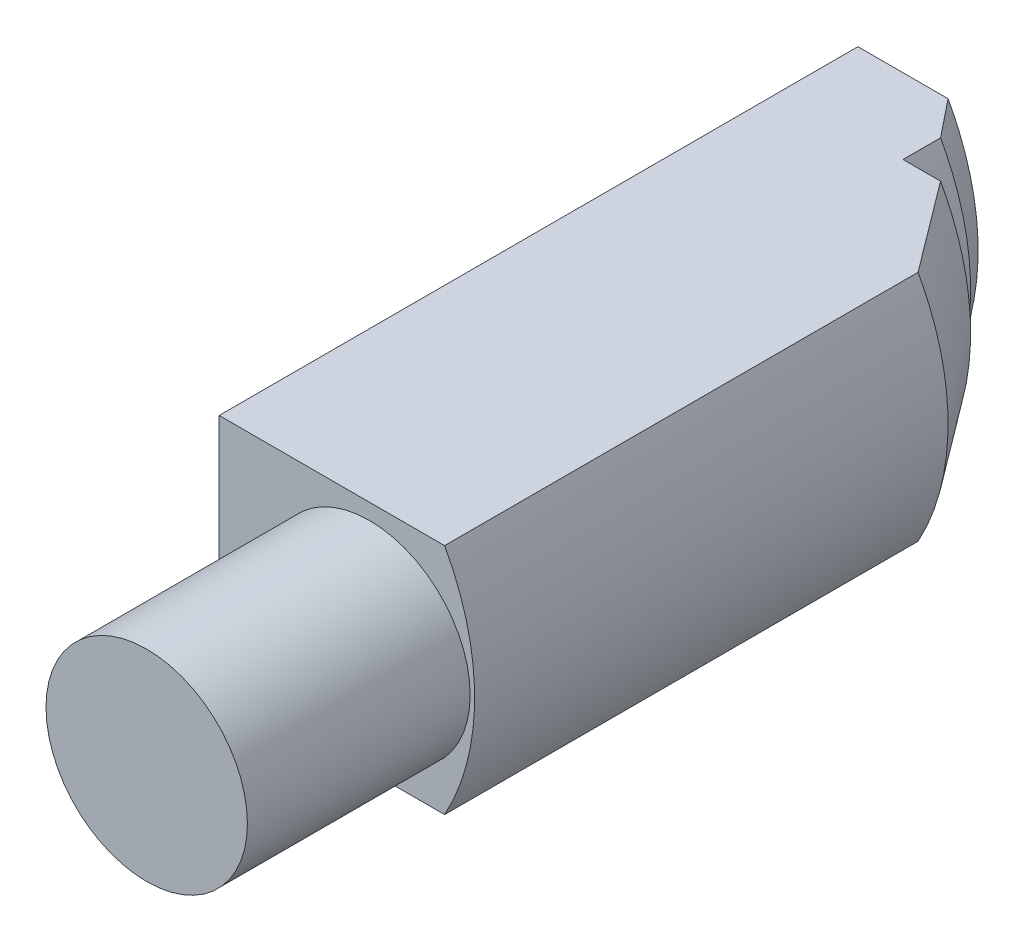
ISO-10303-21;
HEADER;
FILE_DESCRIPTION(('STEP AP214'),'2;1');
FILE_NAME('part.step','',(''),(''),'','','');
FILE_SCHEMA(('AUTOMOTIVE_DESIGN { 1 0 10303 214 1 1 1 1 }'));
ENDSEC;
DATA;
#1=APPLICATION_CONTEXT('core data for automotive mechanical design processes');
#2=APPLICATION_PROTOCOL_DEFINITION('international standard','automotive_design',2000,#1);
#3=PRODUCT_CONTEXT('',#1,'mechanical');
#4=PRODUCT('Part','Part','',(#3));
#5=PRODUCT_RELATED_PRODUCT_CATEGORY('part','',(#4));
#6=PRODUCT_DEFINITION_FORMATION('','',#4);
#7=PRODUCT_DEFINITION_CONTEXT('part definition',#1,'design');
#8=PRODUCT_DEFINITION('design','',#6,#7);
#9=PRODUCT_DEFINITION_SHAPE('','',#8);
#10=(LENGTH_UNIT() NAMED_UNIT(*) SI_UNIT(.MILLI.,.METRE.));
#11=(NAMED_UNIT(*) PLANE_ANGLE_UNIT() SI_UNIT($,.RADIAN.));
#12=(NAMED_UNIT(*) SI_UNIT($,.STERADIAN.) SOLID_ANGLE_UNIT());
#13=UNCERTAINTY_MEASURE_WITH_UNIT(LENGTH_MEASURE(1.E-05),#10,'distance_accuracy_value','');
#14=(GEOMETRIC_REPRESENTATION_CONTEXT(3) GLOBAL_UNCERTAINTY_ASSIGNED_CONTEXT((#13)) GLOBAL_UNIT_ASSIGNED_CONTEXT((#10,
#11,#12)) REPRESENTATION_CONTEXT('',''));
#15=CARTESIAN_POINT('',(0.,0.,0.));
#16=DIRECTION('',(0.,0.,1.));
#17=DIRECTION('',(1.,0.,0.));
#18=AXIS2_PLACEMENT_3D('',#15,#16,#17);
#19=CARTESIAN_POINT('',(-75.,-77.5,425.));
#20=DIRECTION('',(0.,1.,0.));
#21=DIRECTION('',(0.,0.,1.));
#22=AXIS2_PLACEMENT_3D('',#19,#20,#21);
#23=PLANE('',#22);
#24=DIRECTION('',(-0.62469504755442,0.,-0.780868809443034));
#25=VECTOR('',#24,1.);
#26=CARTESIAN_POINT('',(4.99999999999996,-77.5,24.9999999999999));
#27=LINE('',#26,#25);
#28=CARTESIAN_POINT('',(4.99999999999996,-77.5,24.9999999999999));
#29=VERTEX_POINT('',#28);
#30=CARTESIAN_POINT('',(-15.,-77.5,-3.20056481317721E-13));
#31=VERTEX_POINT('',#30);
#32=EDGE_CURVE('E210',#29,#31,#27,.T.);
#33=ORIENTED_EDGE('',*,*,#32,.F.);
#34=DIRECTION('',(0.,0.,-1.));
#35=VECTOR('',#34,1.);
#36=CARTESIAN_POINT('',(4.9999999999999,-77.5,49.9999999999999));
#37=LINE('',#36,#35);
#38=CARTESIAN_POINT('',(4.9999999999999,-77.5,49.9999999999999));
#39=VERTEX_POINT('',#38);
#40=EDGE_CURVE('E124',#39,#29,#37,.T.);
#41=ORIENTED_EDGE('',*,*,#40,.F.);
#42=DIRECTION('',(-1.,0.,0.));
#43=VECTOR('',#42,1.);
#44=CARTESIAN_POINT('',(4.9999999999999,-77.5,49.9999999999999));
#45=LINE('',#44,#43);
#46=CARTESIAN_POINT('',(29.9999999999999,-77.5,49.9999999999999));
#47=VERTEX_POINT('',#46);
#48=EDGE_CURVE('E211',#47,#39,#45,.T.);
#49=ORIENTED_EDGE('',*,*,#48,.F.);
#50=DIRECTION('',(-0.599999999999999,0.,-0.800000000000001));
#51=VECTOR('',#50,1.);
#52=CARTESIAN_POINT('',(29.9999999999999,-77.5,49.9999999999999));
#53=LINE('',#52,#51);
#54=CARTESIAN_POINT('',(74.9999999999998,-77.5,110.));
#55=VERTEX_POINT('',#54);
#56=EDGE_CURVE('E198',#55,#47,#53,.T.);
#57=ORIENTED_EDGE('',*,*,#56,.F.);
#58=DIRECTION('',(0.,0.,-1.));
#59=VECTOR('',#58,1.);
#60=CARTESIAN_POINT('',(75.0000000000001,-77.5,425.));
#61=LINE('',#60,#59);
#62=CARTESIAN_POINT('',(75.0000000000001,-77.5,425.));
#63=VERTEX_POINT('',#62);
#64=EDGE_CURVE('E322',#63,#55,#61,.T.);
#65=ORIENTED_EDGE('',*,*,#64,.F.);
#66=DIRECTION('',(1.,0.,0.));
#67=VECTOR('',#66,1.);
#68=CARTESIAN_POINT('',(-75.,-77.5,425.));
#69=LINE('',#68,#67);
#70=CARTESIAN_POINT('',(-75.,-77.5,425.));
#71=VERTEX_POINT('',#70);
#72=EDGE_CURVE('E172',#71,#63,#69,.T.);
#73=ORIENTED_EDGE('',*,*,#72,.F.);
#74=DIRECTION('',(0.,0.,-1.));
#75=VECTOR('',#74,1.);
#76=CARTESIAN_POINT('',(-75.,-77.5,425.));
#77=LINE('',#76,#75);
#78=CARTESIAN_POINT('',(-75.,-77.5,0.));
#79=VERTEX_POINT('',#78);
#80=EDGE_CURVE('E131',#71,#79,#77,.T.);
#81=ORIENTED_EDGE('',*,*,#80,.T.);
#82=DIRECTION('',(1.,0.,0.));
#83=VECTOR('',#82,1.);
#84=CARTESIAN_POINT('',(-75.,-77.5,0.));
#85=LINE('',#84,#83);
#86=EDGE_CURVE('E310',#79,#31,#85,.T.);
#87=ORIENTED_EDGE('',*,*,#86,.T.);
#88=EDGE_LOOP('',(#33,#41,#49,#57,#65,#73,#81,#87));
#89=FACE_BOUND('',#88,.T.);
#90=ADVANCED_FACE('F120',(#89),#23,.F.);
#91=CARTESIAN_POINT('',(-75.,77.5,425.));
#92=DIRECTION('',(0.,-1.,0.));
#93=DIRECTION('',(0.,0.,-1.));
#94=AXIS2_PLACEMENT_3D('',#91,#92,#93);
#95=PLANE('',#94);
#96=DIRECTION('',(-0.599999999999996,0.,-0.800000000000003));
#97=VECTOR('',#96,1.);
#98=CARTESIAN_POINT('',(29.9999999999998,77.5,49.9999999999998));
#99=LINE('',#98,#97);
#100=CARTESIAN_POINT('',(75.,77.5,110.));
#101=VERTEX_POINT('',#100);
#102=CARTESIAN_POINT('',(29.9999999999998,77.5,49.9999999999998));
#103=VERTEX_POINT('',#102);
#104=EDGE_CURVE('E139',#101,#103,#99,.T.);
#105=ORIENTED_EDGE('',*,*,#104,.T.);
#106=DIRECTION('',(-1.,0.,0.));
#107=VECTOR('',#106,1.);
#108=CARTESIAN_POINT('',(4.99999999999975,77.5,49.9999999999997));
#109=LINE('',#108,#107);
#110=CARTESIAN_POINT('',(4.99999999999975,77.5,49.9999999999997));
#111=VERTEX_POINT('',#110);
#112=EDGE_CURVE('E221',#103,#111,#109,.T.);
#113=ORIENTED_EDGE('',*,*,#112,.T.);
#114=DIRECTION('',(0.,0.,-1.));
#115=VECTOR('',#114,1.);
#116=CARTESIAN_POINT('',(4.99999999999975,77.5,49.9999999999997));
#117=LINE('',#116,#115);
#118=CARTESIAN_POINT('',(4.99999999999987,77.5,24.9999999999997));
#119=VERTEX_POINT('',#118);
#120=EDGE_CURVE('E236',#111,#119,#117,.T.);
#121=ORIENTED_EDGE('',*,*,#120,.T.);
#122=DIRECTION('',(-0.624695047554418,0.,-0.780868809443035));
#123=VECTOR('',#122,1.);
#124=CARTESIAN_POINT('',(4.99999999999987,77.5,24.9999999999997));
#125=LINE('',#124,#123);
#126=CARTESIAN_POINT('',(-15.,77.5,-5.62050406216485E-13));
#127=VERTEX_POINT('',#126);
#128=EDGE_CURVE('E248',#119,#127,#125,.T.);
#129=ORIENTED_EDGE('',*,*,#128,.T.);
#130=DIRECTION('',(-1.,0.,0.));
#131=VECTOR('',#130,1.);
#132=CARTESIAN_POINT('',(-75.,77.5,0.));
#133=LINE('',#132,#131);
#134=CARTESIAN_POINT('',(-75.,77.5,0.));
#135=VERTEX_POINT('',#134);
#136=EDGE_CURVE('E164',#127,#135,#133,.T.);
#137=ORIENTED_EDGE('',*,*,#136,.T.);
#138=DIRECTION('',(0.,0.,-1.));
#139=VECTOR('',#138,1.);
#140=CARTESIAN_POINT('',(-75.,77.5,425.));
#141=LINE('',#140,#139);
#142=CARTESIAN_POINT('',(-75.,77.5,425.));
#143=VERTEX_POINT('',#142);
#144=EDGE_CURVE('E323',#143,#135,#141,.T.);
#145=ORIENTED_EDGE('',*,*,#144,.F.);
#146=DIRECTION('',(-1.,0.,0.));
#147=VECTOR('',#146,1.);
#148=CARTESIAN_POINT('',(-75.,77.5,425.));
#149=LINE('',#148,#147);
#150=CARTESIAN_POINT('',(75.,77.5,425.));
#151=VERTEX_POINT('',#150);
#152=EDGE_CURVE('E149',#151,#143,#149,.T.);
#153=ORIENTED_EDGE('',*,*,#152,.F.);
#154=DIRECTION('',(0.,0.,-1.));
#155=VECTOR('',#154,1.);
#156=CARTESIAN_POINT('',(75.,77.5,425.));
#157=LINE('',#156,#155);
#158=EDGE_CURVE('E262',#151,#101,#157,.T.);
#159=ORIENTED_EDGE('',*,*,#158,.T.);
#160=EDGE_LOOP('',(#105,#113,#121,#129,#137,#145,#153,#159));
#161=FACE_BOUND('',#160,.T.);
#162=ADVANCED_FACE('F259',(#161),#95,.F.);
#163=CARTESIAN_POINT('',(-75.,77.5,425.));
#164=DIRECTION('',(1.,0.,0.));
#165=DIRECTION('',(0.,1.,0.));
#166=AXIS2_PLACEMENT_3D('',#163,#164,#165);
#167=PLANE('',#166);
#168=DIRECTION('',(0.,-1.,0.));
#169=VECTOR('',#168,1.);
#170=CARTESIAN_POINT('',(-75.,77.5,0.));
#171=LINE('',#170,#169);
#172=EDGE_CURVE('E307',#135,#79,#171,.T.);
#173=ORIENTED_EDGE('',*,*,#172,.T.);
#174=ORIENTED_EDGE('',*,*,#80,.F.);
#175=DIRECTION('',(0.,-1.,0.));
#176=VECTOR('',#175,1.);
#177=CARTESIAN_POINT('',(-75.,77.5,425.));
#178=LINE('',#177,#176);
#179=EDGE_CURVE('E309',#143,#71,#178,.T.);
#180=ORIENTED_EDGE('',*,*,#179,.F.);
#181=ORIENTED_EDGE('',*,*,#144,.T.);
#182=EDGE_LOOP('',(#173,#174,#180,#181));
#183=FACE_BOUND('',#182,.T.);
#184=ADVANCED_FACE('F122',(#183),#167,.F.);
#185=CARTESIAN_POINT('',(-65.15625,0.,425.));
#186=DIRECTION('',(0.,0.,-1.));
#187=DIRECTION('',(-1.,0.,0.));
#188=AXIS2_PLACEMENT_3D('',#185,#186,#187);
#189=CYLINDRICAL_SURFACE('',#188,160.15625);
#190=ORIENTED_EDGE('',*,*,#64,.T.);
#191=CARTESIAN_POINT('',(74.9999999999998,-77.5,110.));
#192=CARTESIAN_POINT('',(101.663535191219,-29.2798567207182,110.));
#193=CARTESIAN_POINT('',(101.663535191219,29.2798567207181,110.));
#194=CARTESIAN_POINT('',(74.9999999999995,77.5,110.));
#195=B_SPLINE_CURVE_WITH_KNOTS('',3,(#191,#192,#193,#194),.UNSPECIFIED.,.F.,.F.,(4,4),(0.,1.),.UNSPECIFIED.);
#196=EDGE_CURVE('E204',#55,#101,#195,.T.);
#197=ORIENTED_EDGE('',*,*,#196,.T.);
#198=ORIENTED_EDGE('',*,*,#158,.F.);
#199=CARTESIAN_POINT('',(-65.15625,0.,425.));
#200=DIRECTION('',(0.,0.,1.));
#201=DIRECTION('',(-1.,0.,0.));
#202=AXIS2_PLACEMENT_3D('',#199,#200,#201);
#203=CIRCLE('',#202,160.15625);
#204=EDGE_CURVE('E338',#63,#151,#203,.T.);
#205=ORIENTED_EDGE('',*,*,#204,.F.);
#206=EDGE_LOOP('',(#190,#197,#198,#205));
#207=FACE_BOUND('',#206,.T.);
#208=ADVANCED_FACE('F283',(#207),#189,.T.);
#209=CARTESIAN_POINT('',(-65.15625,0.,425.));
#210=DIRECTION('',(0.,0.,-1.));
#211=DIRECTION('',(-1.,0.,0.));
#212=AXIS2_PLACEMENT_3D('',#209,#210,#211);
#213=PLANE('',#212);
#214=CARTESIAN_POINT('',(25.,0.,425.));
#215=DIRECTION('',(0.,0.,1.));
#216=DIRECTION('',(1.,0.,0.));
#217=AXIS2_PLACEMENT_3D('',#214,#215,#216);
#218=CIRCLE('',#217,67.);
#219=CARTESIAN_POINT('',(92.,0.,425.));
#220=VERTEX_POINT('',#219);
#221=EDGE_CURVE('E13',#220,#220,#218,.T.);
#222=ORIENTED_EDGE('',*,*,#221,.F.);
#223=EDGE_LOOP('',(#222));
#224=FACE_BOUND('',#223,.T.);
#225=ORIENTED_EDGE('',*,*,#179,.T.);
#226=ORIENTED_EDGE('',*,*,#72,.T.);
#227=ORIENTED_EDGE('',*,*,#204,.T.);
#228=ORIENTED_EDGE('',*,*,#152,.T.);
#229=EDGE_LOOP('',(#225,#226,#227,#228));
#230=FACE_BOUND('',#229,.T.);
#231=ADVANCED_FACE('F503',(#224,#230),#213,.F.);
#232=CARTESIAN_POINT('',(-65.15625,0.,0.));
#233=DIRECTION('',(0.,0.,-1.));
#234=DIRECTION('',(-1.,0.,0.));
#235=AXIS2_PLACEMENT_3D('',#232,#233,#234);
#236=PLANE('',#235);
#237=CARTESIAN_POINT('',(-15.,-77.5,-3.12250225675825E-13));
#238=CARTESIAN_POINT('',(11.6635351912193,-29.2798567207182,-3.94938711364053E-13));
#239=CARTESIAN_POINT('',(11.6635351912193,29.2798567207181,-4.78494558790269E-13));
#240=CARTESIAN_POINT('',(-15.,77.5,-5.62050406216485E-13));
#241=B_SPLINE_CURVE_WITH_KNOTS('',3,(#237,#238,#239,#240),.UNSPECIFIED.,.F.,.F.,(4,4),(0.,1.),.UNSPECIFIED.);
#242=EDGE_CURVE('E304',#31,#127,#241,.T.);
#243=ORIENTED_EDGE('',*,*,#242,.F.);
#244=ORIENTED_EDGE('',*,*,#86,.F.);
#245=ORIENTED_EDGE('',*,*,#172,.F.);
#246=ORIENTED_EDGE('',*,*,#136,.F.);
#247=EDGE_LOOP('',(#243,#244,#245,#246));
#248=FACE_BOUND('',#247,.T.);
#249=ADVANCED_FACE('F281',(#248),#236,.T.);
#250=CARTESIAN_POINT('',(29.9999999999999,-77.5,49.9999999999999));
#251=CARTESIAN_POINT('',(56.6635351912192,-29.2798567207182,49.9999999999999));
#252=CARTESIAN_POINT('',(56.6635351912191,29.2798567207181,49.9999999999999));
#253=CARTESIAN_POINT('',(29.9999999999998,77.5,49.9999999999998));
#254=CARTESIAN_POINT('',(33.7499999999999,-77.5,54.9999999999999));
#255=CARTESIAN_POINT('',(60.4135351912191,-29.2798567207182,54.9999999999999));
#256=CARTESIAN_POINT('',(60.4135351912191,29.2798567207181,54.9999999999999));
#257=CARTESIAN_POINT('',(33.7499999999997,77.5,54.9999999999998));
#258=CARTESIAN_POINT('',(41.2499999999999,-77.5000000000001,65.));
#259=CARTESIAN_POINT('',(67.9135351912192,-29.2798567207183,64.9999999999999));
#260=CARTESIAN_POINT('',(67.9135351912192,29.2798567207182,64.9999999999999));
#261=CARTESIAN_POINT('',(41.2499999999998,77.5000000000001,64.9999999999999));
#262=CARTESIAN_POINT('',(52.4999999999998,-77.4999999999999,79.9999999999999));
#263=CARTESIAN_POINT('',(79.163535191219,-29.2798567207182,79.9999999999999));
#264=CARTESIAN_POINT('',(79.163535191219,29.2798567207181,79.9999999999999));
#265=CARTESIAN_POINT('',(52.4999999999995,77.4999999999999,79.9999999999999));
#266=CARTESIAN_POINT('',(63.7499999999999,-77.5000000000001,94.9999999999999));
#267=CARTESIAN_POINT('',(90.4135351912191,-29.2798567207183,94.9999999999999));
#268=CARTESIAN_POINT('',(90.4135351912191,29.2798567207181,94.9999999999999));
#269=CARTESIAN_POINT('',(63.7499999999997,77.5,94.9999999999999));
#270=CARTESIAN_POINT('',(71.2499999999998,-77.5,105.));
#271=CARTESIAN_POINT('',(97.913535191219,-29.2798567207182,105.));
#272=CARTESIAN_POINT('',(97.9135351912189,29.2798567207181,105.));
#273=CARTESIAN_POINT('',(71.2499999999995,77.5,105.));
#274=CARTESIAN_POINT('',(74.9999999999998,-77.5,110.));
#275=CARTESIAN_POINT('',(101.663535191219,-29.2798567207182,110.));
#276=CARTESIAN_POINT('',(101.663535191219,29.2798567207181,110.));
#277=CARTESIAN_POINT('',(74.9999999999995,77.5,110.));
#278=B_SPLINE_SURFACE_WITH_KNOTS('',3,3,((#250,#251,#252,#253),(#254,#255,#256,#257),(#258,#259,
#260,#261),(#262,#263,#264,#265),(#266,#267,#268,#269),(#270,#271,#272,#273),(#274,#275,#276,
#277)),.UNSPECIFIED.,.F.,.F.,.F.,(4,1,1,1,4),(4,4),(0.481815391201008,0.534334101552257,
0.586852811903506,0.639371522254755,0.691890232606005),(0.,1.),.UNSPECIFIED.);
#279=CARTESIAN_POINT('',(29.9999999999999,-77.5,49.9999999999999));
#280=CARTESIAN_POINT('',(56.6635351912192,-29.2798567207182,49.9999999999999));
#281=CARTESIAN_POINT('',(56.6635351912191,29.2798567207181,49.9999999999999));
#282=CARTESIAN_POINT('',(29.9999999999998,77.5,49.9999999999998));
#283=B_SPLINE_CURVE_WITH_KNOTS('',3,(#279,#280,#281,#282),.UNSPECIFIED.,.F.,.F.,(4,4),(0.,1.),.UNSPECIFIED.);
#284=EDGE_CURVE('E202',#47,#103,#283,.T.);
#285=ORIENTED_EDGE('',*,*,#56,.T.);
#286=ORIENTED_EDGE('',*,*,#284,.T.);
#287=ORIENTED_EDGE('',*,*,#104,.F.);
#288=ORIENTED_EDGE('',*,*,#196,.F.);
#289=EDGE_LOOP('',(#285,#286,#287,#288));
#290=FACE_BOUND('',#289,.T.);
#291=ADVANCED_FACE('F201',(#290),#278,.F.);
#292=CARTESIAN_POINT('',(4.9999999999999,-77.5,49.9999999999999));
#293=DIRECTION('',(0.,0.,1.));
#294=DIRECTION('',(1.,0.,0.));
#295=AXIS2_PLACEMENT_3D('',#292,#293,#294);
#296=PLANE('',#295);
#297=ORIENTED_EDGE('',*,*,#48,.T.);
#298=CARTESIAN_POINT('',(4.9999999999999,-77.5,49.9999999999999));
#299=CARTESIAN_POINT('',(31.6635351912191,-29.2798567207182,49.9999999999998));
#300=CARTESIAN_POINT('',(31.6635351912191,29.2798567207181,49.9999999999997));
#301=CARTESIAN_POINT('',(4.99999999999975,77.5,49.9999999999997));
#302=B_SPLINE_CURVE_WITH_KNOTS('',3,(#298,#299,#300,#301),.UNSPECIFIED.,.F.,.F.,(4,4),(0.,1.),.UNSPECIFIED.);
#303=EDGE_CURVE('E223',#39,#111,#302,.T.);
#304=ORIENTED_EDGE('',*,*,#303,.T.);
#305=ORIENTED_EDGE('',*,*,#112,.F.);
#306=ORIENTED_EDGE('',*,*,#284,.F.);
#307=EDGE_LOOP('',(#297,#304,#305,#306));
#308=FACE_BOUND('',#307,.T.);
#309=ADVANCED_FACE('F217',(#308),#296,.F.);
#310=CARTESIAN_POINT('',(4.99999999999996,-77.5,24.9999999999999));
#311=CARTESIAN_POINT('',(31.6635351912192,-29.2798567207182,24.9999999999998));
#312=CARTESIAN_POINT('',(31.6635351912192,29.2798567207181,24.9999999999997));
#313=CARTESIAN_POINT('',(4.99999999999987,77.5,24.9999999999997));
#314=CARTESIAN_POINT('',(4.99999999999995,-77.5,27.0833333333332));
#315=CARTESIAN_POINT('',(31.6635351912192,-29.2798567207182,27.0833333333331));
#316=CARTESIAN_POINT('',(31.6635351912192,29.2798567207181,27.0833333333331));
#317=CARTESIAN_POINT('',(4.99999999999986,77.5,27.083333333333));
#318=CARTESIAN_POINT('',(4.99999999999995,-77.5000000000001,31.2499999999999));
#319=CARTESIAN_POINT('',(31.6635351912192,-29.2798567207182,31.2499999999998));
#320=CARTESIAN_POINT('',(31.6635351912192,29.2798567207182,31.2499999999998));
#321=CARTESIAN_POINT('',(4.99999999999985,77.5000000000001,31.2499999999997));
#322=CARTESIAN_POINT('',(4.99999999999993,-77.4999999999999,37.4999999999999));
#323=CARTESIAN_POINT('',(31.6635351912192,-29.2798567207182,37.4999999999998));
#324=CARTESIAN_POINT('',(31.6635351912192,29.2798567207181,37.4999999999997));
#325=CARTESIAN_POINT('',(4.9999999999998,77.4999999999999,37.4999999999996));
#326=CARTESIAN_POINT('',(4.99999999999991,-77.5000000000001,43.7499999999999));
#327=CARTESIAN_POINT('',(31.6635351912192,-29.2798567207183,43.7499999999998));
#328=CARTESIAN_POINT('',(31.6635351912192,29.2798567207182,43.7499999999998));
#329=CARTESIAN_POINT('',(4.99999999999979,77.5000000000001,43.7499999999997));
#330=CARTESIAN_POINT('',(4.99999999999991,-77.5,47.9166666666665));
#331=CARTESIAN_POINT('',(31.6635351912192,-29.2798567207182,47.9166666666665));
#332=CARTESIAN_POINT('',(31.6635351912191,29.2798567207181,47.9166666666664));
#333=CARTESIAN_POINT('',(4.99999999999976,77.5,47.9166666666663));
#334=CARTESIAN_POINT('',(4.9999999999999,-77.5,49.9999999999999));
#335=CARTESIAN_POINT('',(31.6635351912191,-29.2798567207182,49.9999999999998));
#336=CARTESIAN_POINT('',(31.6635351912191,29.2798567207181,49.9999999999997));
#337=CARTESIAN_POINT('',(4.99999999999975,77.5,49.9999999999997));
#338=B_SPLINE_SURFACE_WITH_KNOTS('',3,3,((#310,#311,#312,#313),(#314,#315,#316,#317),(#318,#319,
#320,#321),(#322,#323,#324,#325),(#326,#327,#328,#329),(#330,#331,#332,#333),(#334,#335,#336,
#337)),.UNSPECIFIED.,.F.,.F.,.F.,(4,1,1,1,4),(4,4),(0.34176549693101,0.35927173371476,
0.376777970498509,0.394284207282259,0.411790444066009),(0.,1.),.UNSPECIFIED.);
#339=CARTESIAN_POINT('',(4.99999999999996,-77.5,24.9999999999999));
#340=CARTESIAN_POINT('',(31.6635351912192,-29.2798567207182,24.9999999999998));
#341=CARTESIAN_POINT('',(31.6635351912192,29.2798567207181,24.9999999999997));
#342=CARTESIAN_POINT('',(4.99999999999987,77.5,24.9999999999997));
#343=B_SPLINE_CURVE_WITH_KNOTS('',3,(#339,#340,#341,#342),.UNSPECIFIED.,.F.,.F.,(4,4),(0.,1.),.UNSPECIFIED.);
#344=EDGE_CURVE('E423',#29,#119,#343,.T.);
#345=ORIENTED_EDGE('',*,*,#40,.T.);
#346=ORIENTED_EDGE('',*,*,#344,.T.);
#347=ORIENTED_EDGE('',*,*,#120,.F.);
#348=ORIENTED_EDGE('',*,*,#303,.F.);
#349=EDGE_LOOP('',(#345,#346,#347,#348));
#350=FACE_BOUND('',#349,.T.);
#351=ADVANCED_FACE('F357',(#350),#338,.F.);
#352=CARTESIAN_POINT('',(-15.,-77.5,-3.12250225675825E-13));
#353=CARTESIAN_POINT('',(11.6635351912193,-29.2798567207182,-3.94938711364053E-13));
#354=CARTESIAN_POINT('',(11.6635351912193,29.2798567207181,-4.78494558790269E-13));
#355=CARTESIAN_POINT('',(-15.,77.5,-5.62050406216485E-13));
#356=CARTESIAN_POINT('',(-13.3333333333333,-77.5,2.08333333333304));
#357=CARTESIAN_POINT('',(13.330201857886,-29.2798567207182,2.08333333333296));
#358=CARTESIAN_POINT('',(13.330201857886,29.2798567207181,2.08333333333288));
#359=CARTESIAN_POINT('',(-13.3333333333333,77.5,2.08333333333279));
#360=CARTESIAN_POINT('',(-10.,-77.5,6.24999999999974));
#361=CARTESIAN_POINT('',(16.6635351912193,-29.2798567207182,6.24999999999966));
#362=CARTESIAN_POINT('',(16.6635351912193,29.2798567207181,6.24999999999958));
#363=CARTESIAN_POINT('',(-10.,77.4999999999999,6.2499999999995));
#364=CARTESIAN_POINT('',(-5.,-77.5000000000001,12.4999999999998));
#365=CARTESIAN_POINT('',(21.6635351912193,-29.2798567207182,12.4999999999997));
#366=CARTESIAN_POINT('',(21.6635351912193,29.2798567207182,12.4999999999996));
#367=CARTESIAN_POINT('',(-5.00000000000006,77.5000000000002,12.4999999999996));
#368=CARTESIAN_POINT('',(0.,-77.4999999999999,18.7499999999998));
#369=CARTESIAN_POINT('',(26.6635351912192,-29.2798567207182,18.7499999999998));
#370=CARTESIAN_POINT('',(26.6635351912192,29.2798567207181,18.7499999999997));
#371=CARTESIAN_POINT('',(0.,77.4999999999999,18.7499999999996));
#372=CARTESIAN_POINT('',(3.33333333333329,-77.5,22.9166666666665));
#373=CARTESIAN_POINT('',(29.9968685245526,-29.2798567207182,22.9166666666665));
#374=CARTESIAN_POINT('',(29.9968685245526,29.2798567207181,22.9166666666664));
#375=CARTESIAN_POINT('',(3.33333333333321,77.5,22.9166666666663));
#376=CARTESIAN_POINT('',(4.99999999999996,-77.5,24.9999999999999));
#377=CARTESIAN_POINT('',(31.6635351912192,-29.2798567207182,24.9999999999998));
#378=CARTESIAN_POINT('',(31.6635351912192,29.2798567207181,24.9999999999997));
#379=CARTESIAN_POINT('',(4.99999999999987,77.5,24.9999999999997));
#380=B_SPLINE_SURFACE_WITH_KNOTS('',3,3,((#352,#353,#354,#355),(#356,#357,#358,#359),(#360,#361,
#362,#363),(#364,#365,#366,#367),(#368,#369,#370,#371),(#372,#373,#374,#375),(#376,#377,#378,
#379)),.UNSPECIFIED.,.F.,.F.,.F.,(4,1,1,1,4),(4,4),(0.252089809685996,0.27450873149725,
0.296927653308503,0.319346575119756,0.34176549693101),(0.,1.),.UNSPECIFIED.);
#381=ORIENTED_EDGE('',*,*,#32,.T.);
#382=ORIENTED_EDGE('',*,*,#242,.T.);
#383=ORIENTED_EDGE('',*,*,#128,.F.);
#384=ORIENTED_EDGE('',*,*,#344,.F.);
#385=EDGE_LOOP('',(#381,#382,#383,#384));
#386=FACE_BOUND('',#385,.T.);
#387=ADVANCED_FACE('F385',(#386),#380,.F.);
#388=CARTESIAN_POINT('',(25.,0.,573.21914514));
#389=DIRECTION('',(0.,0.,-1.));
#390=DIRECTION('',(-1.,0.,0.));
#391=AXIS2_PLACEMENT_3D('',#388,#389,#390);
#392=CYLINDRICAL_SURFACE('',#391,67.);
#393=CARTESIAN_POINT('',(25.,0.,573.21914514));
#394=DIRECTION('',(0.,0.,1.));
#395=DIRECTION('',(1.,0.,0.));
#396=AXIS2_PLACEMENT_3D('',#393,#394,#395);
#397=CIRCLE('',#396,67.);
#398=CARTESIAN_POINT('',(92.,0.,573.21914514));
#399=VERTEX_POINT('',#398);
#400=EDGE_CURVE('E228',#399,#399,#397,.T.);
#401=ORIENTED_EDGE('',*,*,#400,.F.);
#402=EDGE_LOOP('',(#401));
#403=FACE_BOUND('',#402,.T.);
#404=ORIENTED_EDGE('',*,*,#221,.T.);
#405=EDGE_LOOP('',(#404));
#406=FACE_BOUND('',#405,.T.);
#407=ADVANCED_FACE('F396',(#403,#406),#392,.T.);
#408=CARTESIAN_POINT('',(25.,0.,573.21914514));
#409=DIRECTION('',(0.,0.,1.));
#410=DIRECTION('',(1.,0.,0.));
#411=AXIS2_PLACEMENT_3D('',#408,#409,#410);
#412=PLANE('',#411);
#413=ORIENTED_EDGE('',*,*,#400,.T.);
#414=EDGE_LOOP('',(#413));
#415=FACE_BOUND('',#414,.T.);
#416=ADVANCED_FACE('F541',(#415),#412,.T.);
#417=CLOSED_SHELL('',(#90,#162,#184,#208,#231,#249,#291,#309,#351,#387,#407,#416));
#418=MANIFOLD_SOLID_BREP('B2',#417);
#419=ADVANCED_BREP_SHAPE_REPRESENTATION('',(#18,#418),#14);
#420=SHAPE_DEFINITION_REPRESENTATION(#9,#419);
ENDSEC;
END-ISO-10303-21;
